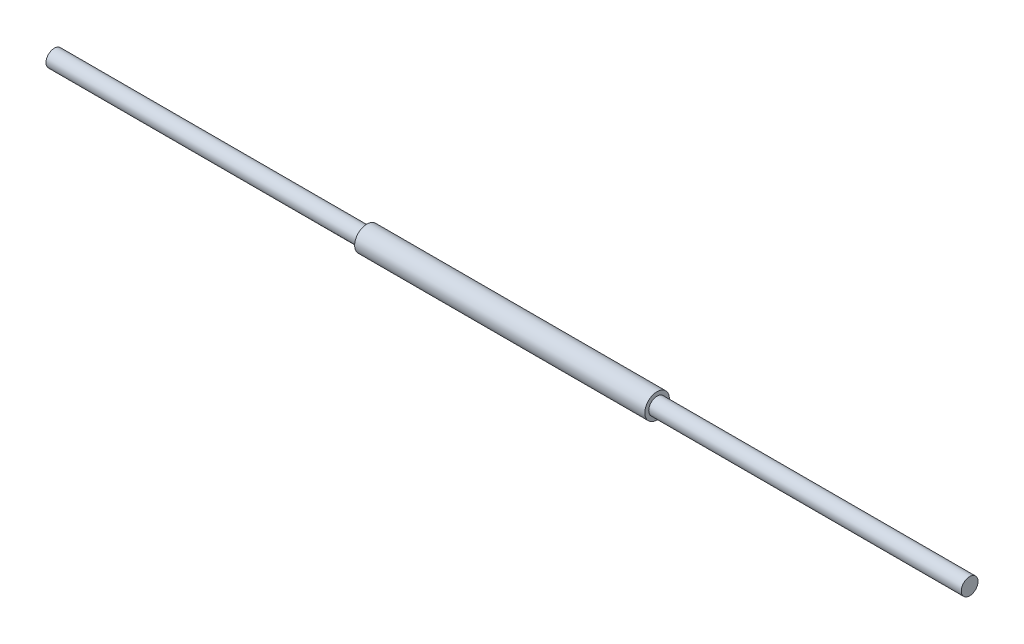
ISO-10303-21;
HEADER;
FILE_DESCRIPTION(('STEP AP214'),'2;1');
FILE_NAME('part.step','',(''),(''),'','','');
FILE_SCHEMA(('AUTOMOTIVE_DESIGN { 1 0 10303 214 1 1 1 1 }'));
ENDSEC;
DATA;
#1=APPLICATION_CONTEXT('core data for automotive mechanical design processes');
#2=APPLICATION_PROTOCOL_DEFINITION('international standard','automotive_design',2000,#1);
#3=PRODUCT_CONTEXT('',#1,'mechanical');
#4=PRODUCT('Part','Part','',(#3));
#5=PRODUCT_RELATED_PRODUCT_CATEGORY('part','',(#4));
#6=PRODUCT_DEFINITION_FORMATION('','',#4);
#7=PRODUCT_DEFINITION_CONTEXT('part definition',#1,'design');
#8=PRODUCT_DEFINITION('design','',#6,#7);
#9=PRODUCT_DEFINITION_SHAPE('','',#8);
#10=(LENGTH_UNIT() NAMED_UNIT(*) SI_UNIT(.MILLI.,.METRE.));
#11=(NAMED_UNIT(*) PLANE_ANGLE_UNIT() SI_UNIT($,.RADIAN.));
#12=(NAMED_UNIT(*) SI_UNIT($,.STERADIAN.) SOLID_ANGLE_UNIT());
#13=UNCERTAINTY_MEASURE_WITH_UNIT(LENGTH_MEASURE(1.E-05),#10,'distance_accuracy_value','');
#14=(GEOMETRIC_REPRESENTATION_CONTEXT(3) GLOBAL_UNCERTAINTY_ASSIGNED_CONTEXT((#13)) GLOBAL_UNIT_ASSIGNED_CONTEXT((#10,
#11,#12)) REPRESENTATION_CONTEXT('',''));
#15=CARTESIAN_POINT('',(0.,0.,0.));
#16=DIRECTION('',(0.,0.,1.));
#17=DIRECTION('',(1.,0.,0.));
#18=AXIS2_PLACEMENT_3D('',#15,#16,#17);
#19=CARTESIAN_POINT('',(-260.35,0.,0.));
#20=DIRECTION('',(1.,0.,0.));
#21=DIRECTION('',(0.,1.,0.));
#22=AXIS2_PLACEMENT_3D('',#19,#20,#21);
#23=PLANE('',#22);
#24=CARTESIAN_POINT('',(-260.35,-3.49249999999996,0.));
#25=DIRECTION('',(1.,0.,0.));
#26=DIRECTION('',(0.,1.,0.));
#27=AXIS2_PLACEMENT_3D('',#24,#25,#26);
#28=CIRCLE('',#27,4.7625);
#29=CARTESIAN_POINT('',(-260.35,1.27000000000004,0.));
#30=VERTEX_POINT('',#29);
#31=EDGE_CURVE('E55',#30,#30,#28,.T.);
#32=ORIENTED_EDGE('',*,*,#31,.F.);
#33=EDGE_LOOP('',(#32));
#34=FACE_BOUND('',#33,.T.);
#35=ADVANCED_FACE('F33',(#34),#23,.F.);
#36=CARTESIAN_POINT('',(260.35,0.,0.));
#37=DIRECTION('',(1.,0.,0.));
#38=DIRECTION('',(0.,1.,0.));
#39=AXIS2_PLACEMENT_3D('',#36,#37,#38);
#40=PLANE('',#39);
#41=CARTESIAN_POINT('',(260.35,-3.49250000000008,0.));
#42=DIRECTION('',(1.,0.,0.));
#43=DIRECTION('',(0.,1.,0.));
#44=AXIS2_PLACEMENT_3D('',#41,#42,#43);
#45=CIRCLE('',#44,4.76250000000011);
#46=CARTESIAN_POINT('',(260.35,1.27000000000004,0.));
#47=VERTEX_POINT('',#46);
#48=EDGE_CURVE('E10',#47,#47,#45,.T.);
#49=ORIENTED_EDGE('',*,*,#48,.T.);
#50=EDGE_LOOP('',(#49));
#51=FACE_BOUND('',#50,.T.);
#52=ADVANCED_FACE('F63',(#51),#40,.T.);
#53=CARTESIAN_POINT('',(-82.5500000000001,-3.4925,0.));
#54=DIRECTION('',(1.,0.,0.));
#55=DIRECTION('',(0.,1.,0.));
#56=AXIS2_PLACEMENT_3D('',#53,#54,#55);
#57=CYLINDRICAL_SURFACE('',#56,4.76250000000009);
#58=ORIENTED_EDGE('',*,*,#48,.F.);
#59=EDGE_LOOP('',(#58));
#60=FACE_BOUND('',#59,.T.);
#61=CARTESIAN_POINT('',(82.5499999999999,-3.49250000000004,0.));
#62=DIRECTION('',(1.,0.,0.));
#63=DIRECTION('',(0.,1.,0.));
#64=AXIS2_PLACEMENT_3D('',#61,#62,#63);
#65=CIRCLE('',#64,4.76250000000006);
#66=CARTESIAN_POINT('',(82.5499999999999,1.27000000000002,0.));
#67=VERTEX_POINT('',#66);
#68=EDGE_CURVE('E39',#67,#67,#65,.T.);
#69=ORIENTED_EDGE('',*,*,#68,.T.);
#70=EDGE_LOOP('',(#69));
#71=FACE_BOUND('',#70,.T.);
#72=ADVANCED_FACE('F67',(#60,#71),#57,.T.);
#73=CARTESIAN_POINT('',(82.5499999999999,0.,0.));
#74=DIRECTION('',(-1.,0.,0.));
#75=DIRECTION('',(0.,-1.,0.));
#76=AXIS2_PLACEMENT_3D('',#73,#74,#75);
#77=PLANE('',#76);
#78=ORIENTED_EDGE('',*,*,#68,.F.);
#79=EDGE_LOOP('',(#78));
#80=FACE_BOUND('',#79,.T.);
#81=CARTESIAN_POINT('',(82.5499999999999,-3.49250000000004,0.));
#82=DIRECTION('',(1.,0.,0.));
#83=DIRECTION('',(0.,1.,0.));
#84=AXIS2_PLACEMENT_3D('',#81,#82,#83);
#85=CIRCLE('',#84,6.98500000000004);
#86=CARTESIAN_POINT('',(82.5499999999999,3.4925,0.));
#87=VERTEX_POINT('',#86);
#88=EDGE_CURVE('E43',#87,#87,#85,.T.);
#89=ORIENTED_EDGE('',*,*,#88,.T.);
#90=EDGE_LOOP('',(#89));
#91=FACE_BOUND('',#90,.T.);
#92=ADVANCED_FACE('F71',(#80,#91),#77,.F.);
#93=CARTESIAN_POINT('',(-82.5500000000001,-3.4925,0.));
#94=DIRECTION('',(1.,0.,0.));
#95=DIRECTION('',(0.,1.,0.));
#96=AXIS2_PLACEMENT_3D('',#93,#94,#95);
#97=CYLINDRICAL_SURFACE('',#96,6.98500000000002);
#98=ORIENTED_EDGE('',*,*,#88,.F.);
#99=EDGE_LOOP('',(#98));
#100=FACE_BOUND('',#99,.T.);
#101=CARTESIAN_POINT('',(-82.5500000000001,-3.4925,0.));
#102=DIRECTION('',(1.,0.,0.));
#103=DIRECTION('',(0.,1.,0.));
#104=AXIS2_PLACEMENT_3D('',#101,#102,#103);
#105=CIRCLE('',#104,6.985);
#106=CARTESIAN_POINT('',(-82.5500000000001,3.4925,0.));
#107=VERTEX_POINT('',#106);
#108=EDGE_CURVE('E47',#107,#107,#105,.T.);
#109=ORIENTED_EDGE('',*,*,#108,.T.);
#110=EDGE_LOOP('',(#109));
#111=FACE_BOUND('',#110,.T.);
#112=ADVANCED_FACE('F77',(#100,#111),#97,.T.);
#113=CARTESIAN_POINT('',(-82.5500000000001,0.,0.));
#114=DIRECTION('',(-1.,0.,0.));
#115=DIRECTION('',(0.,-1.,0.));
#116=AXIS2_PLACEMENT_3D('',#113,#114,#115);
#117=PLANE('',#116);
#118=CARTESIAN_POINT('',(-82.5500000000001,-3.4925,0.));
#119=DIRECTION('',(1.,0.,0.));
#120=DIRECTION('',(0.,1.,0.));
#121=AXIS2_PLACEMENT_3D('',#118,#119,#120);
#122=CIRCLE('',#121,4.7625);
#123=CARTESIAN_POINT('',(-82.5500000000001,1.27,0.));
#124=VERTEX_POINT('',#123);
#125=EDGE_CURVE('E52',#124,#124,#122,.T.);
#126=ORIENTED_EDGE('',*,*,#125,.T.);
#127=EDGE_LOOP('',(#126));
#128=FACE_BOUND('',#127,.T.);
#129=ORIENTED_EDGE('',*,*,#108,.F.);
#130=EDGE_LOOP('',(#129));
#131=FACE_BOUND('',#130,.T.);
#132=ADVANCED_FACE('F81',(#128,#131),#117,.T.);
#133=CARTESIAN_POINT('',(-82.5500000000001,-3.4925,0.));
#134=DIRECTION('',(1.,0.,0.));
#135=DIRECTION('',(0.,1.,0.));
#136=AXIS2_PLACEMENT_3D('',#133,#134,#135);
#137=CYLINDRICAL_SURFACE('',#136,4.7625);
#138=ORIENTED_EDGE('',*,*,#31,.T.);
#139=EDGE_LOOP('',(#138));
#140=FACE_BOUND('',#139,.T.);
#141=ORIENTED_EDGE('',*,*,#125,.F.);
#142=EDGE_LOOP('',(#141));
#143=FACE_BOUND('',#142,.T.);
#144=ADVANCED_FACE('F59',(#140,#143),#137,.T.);
#145=CLOSED_SHELL('',(#35,#52,#72,#92,#112,#132,#144));
#146=MANIFOLD_SOLID_BREP('B2',#145);
#147=ADVANCED_BREP_SHAPE_REPRESENTATION('',(#18,#146),#14);
#148=SHAPE_DEFINITION_REPRESENTATION(#9,#147);
ENDSEC;
END-ISO-10303-21;
